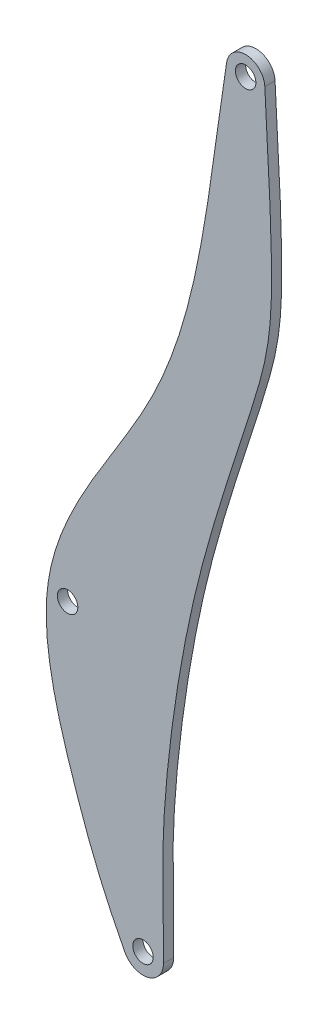
ISO-10303-21;
HEADER;
FILE_DESCRIPTION(('STEP AP214'),'2;1');
FILE_NAME('part.step','',(''),(''),'','','');
FILE_SCHEMA(('AUTOMOTIVE_DESIGN { 1 0 10303 214 1 1 1 1 }'));
ENDSEC;
DATA;
#1=APPLICATION_CONTEXT('core data for automotive mechanical design processes');
#2=APPLICATION_PROTOCOL_DEFINITION('international standard','automotive_design',2000,#1);
#3=PRODUCT_CONTEXT('',#1,'mechanical');
#4=PRODUCT('Part','Part','',(#3));
#5=PRODUCT_RELATED_PRODUCT_CATEGORY('part','',(#4));
#6=PRODUCT_DEFINITION_FORMATION('','',#4);
#7=PRODUCT_DEFINITION_CONTEXT('part definition',#1,'design');
#8=PRODUCT_DEFINITION('design','',#6,#7);
#9=PRODUCT_DEFINITION_SHAPE('','',#8);
#10=(LENGTH_UNIT() NAMED_UNIT(*) SI_UNIT(.MILLI.,.METRE.));
#11=(NAMED_UNIT(*) PLANE_ANGLE_UNIT() SI_UNIT($,.RADIAN.));
#12=(NAMED_UNIT(*) SI_UNIT($,.STERADIAN.) SOLID_ANGLE_UNIT());
#13=UNCERTAINTY_MEASURE_WITH_UNIT(LENGTH_MEASURE(1.E-05),#10,'distance_accuracy_value','');
#14=(GEOMETRIC_REPRESENTATION_CONTEXT(3) GLOBAL_UNCERTAINTY_ASSIGNED_CONTEXT((#13)) GLOBAL_UNIT_ASSIGNED_CONTEXT((#10,
#11,#12)) REPRESENTATION_CONTEXT('',''));
#15=CARTESIAN_POINT('',(0.,0.,0.));
#16=DIRECTION('',(0.,0.,1.));
#17=DIRECTION('',(1.,0.,0.));
#18=AXIS2_PLACEMENT_3D('',#15,#16,#17);
#19=CARTESIAN_POINT('',(83.5740256800296,374.071633918416,10.));
#20=DIRECTION('',(0.,0.,-1.));
#21=DIRECTION('',(-1.,0.,0.));
#22=AXIS2_PLACEMENT_3D('',#19,#20,#21);
#23=CYLINDRICAL_SURFACE('',#22,18.766036201656);
#24=CARTESIAN_POINT('',(83.5740256800296,374.071633918416,0.));
#25=DIRECTION('',(0.,0.,1.));
#26=DIRECTION('',(1.,0.,0.));
#27=AXIS2_PLACEMENT_3D('',#24,#25,#26);
#28=CIRCLE('',#27,18.766036201656);
#29=CARTESIAN_POINT('',(102.311199764937,375.112029051879,0.));
#30=VERTEX_POINT('',#29);
#31=CARTESIAN_POINT('',(65.0364619426126,376.991025191107,0.));
#32=VERTEX_POINT('',#31);
#33=EDGE_CURVE('E144',#30,#32,#28,.T.);
#34=ORIENTED_EDGE('',*,*,#33,.T.);
#35=DIRECTION('',(0.,0.,-1.));
#36=VECTOR('',#35,1.);
#37=CARTESIAN_POINT('',(65.0364619426126,376.991025191107,10.));
#38=LINE('',#37,#36);
#39=CARTESIAN_POINT('',(65.0364619426126,376.991025191107,10.));
#40=VERTEX_POINT('',#39);
#41=EDGE_CURVE('E11',#40,#32,#38,.T.);
#42=ORIENTED_EDGE('',*,*,#41,.F.);
#43=CARTESIAN_POINT('',(83.5740256800296,374.071633918416,10.));
#44=DIRECTION('',(0.,0.,1.));
#45=DIRECTION('',(1.,0.,0.));
#46=AXIS2_PLACEMENT_3D('',#43,#44,#45);
#47=CIRCLE('',#46,18.766036201656);
#48=CARTESIAN_POINT('',(102.311199764937,375.112029051879,10.));
#49=VERTEX_POINT('',#48);
#50=EDGE_CURVE('E86',#49,#40,#47,.T.);
#51=ORIENTED_EDGE('',*,*,#50,.F.);
#52=DIRECTION('',(0.,0.,-1.));
#53=VECTOR('',#52,1.);
#54=CARTESIAN_POINT('',(102.311199764937,375.112029051879,10.));
#55=LINE('',#54,#53);
#56=EDGE_CURVE('E53',#49,#30,#55,.T.);
#57=ORIENTED_EDGE('',*,*,#56,.T.);
#58=EDGE_LOOP('',(#34,#42,#51,#57));
#59=FACE_BOUND('',#58,.T.);
#60=ADVANCED_FACE('F36',(#59),#23,.T.);
#61=CARTESIAN_POINT('',(65.0364619426127,376.991025191107,10.));
#62=CARTESIAN_POINT('',(45.8891142145235,252.942246970304,10.));
#63=CARTESIAN_POINT('',(35.5238069950135,78.6944400884925,10.));
#64=CARTESIAN_POINT('',(-140.807905588771,-126.022717355583,10.));
#65=CARTESIAN_POINT('',(-84.8262219497264,-308.616556426577,10.));
#66=CARTESIAN_POINT('',(-57.33119301241,-381.180627859688,10.));
#67=CARTESIAN_POINT('',(-34.1365743105431,-425.390150910679,10.));
#68=B_SPLINE_CURVE_WITH_KNOTS('',3,(#61,#62,#63,#64,#65,#66,#67),.UNSPECIFIED.,.F.,.F.,(4,1,1,1,
4),(0.,0.394447099617431,0.667710934704423,0.855398118927933,1.),.UNSPECIFIED.);
#69=DIRECTION('',(0.,0.,-1.));
#70=VECTOR('',#69,1.);
#71=SURFACE_OF_LINEAR_EXTRUSION('',#68,#70);
#72=CARTESIAN_POINT('',(65.0364619426127,376.991025191107,0.));
#73=CARTESIAN_POINT('',(45.8891142145235,252.942246970304,0.));
#74=CARTESIAN_POINT('',(35.5238069950135,78.6944400884925,0.));
#75=CARTESIAN_POINT('',(-140.807905588771,-126.022717355583,0.));
#76=CARTESIAN_POINT('',(-84.8262219497264,-308.616556426577,0.));
#77=CARTESIAN_POINT('',(-57.33119301241,-381.180627859688,0.));
#78=CARTESIAN_POINT('',(-34.1365743105431,-425.390150910679,0.));
#79=B_SPLINE_CURVE_WITH_KNOTS('',3,(#72,#73,#74,#75,#76,#77,#78),.UNSPECIFIED.,.F.,.F.,(4,1,1,1,
4),(0.,0.394447099617431,0.667710934704423,0.855398118927933,1.),.UNSPECIFIED.);
#80=CARTESIAN_POINT('',(-34.1365743105431,-425.390150910679,0.));
#81=VERTEX_POINT('',#80);
#82=EDGE_CURVE('E91',#32,#81,#79,.T.);
#83=ORIENTED_EDGE('',*,*,#82,.T.);
#84=DIRECTION('',(0.,0.,-1.));
#85=VECTOR('',#84,1.);
#86=CARTESIAN_POINT('',(-34.1365743105431,-425.390150910679,10.));
#87=LINE('',#86,#85);
#88=CARTESIAN_POINT('',(-34.1365743105431,-425.390150910679,10.));
#89=VERTEX_POINT('',#88);
#90=EDGE_CURVE('E45',#89,#81,#87,.T.);
#91=ORIENTED_EDGE('',*,*,#90,.F.);
#92=EDGE_CURVE('E79',#40,#89,#68,.T.);
#93=ORIENTED_EDGE('',*,*,#92,.F.);
#94=ORIENTED_EDGE('',*,*,#41,.T.);
#95=EDGE_LOOP('',(#83,#91,#93,#94));
#96=FACE_BOUND('',#95,.T.);
#97=ADVANCED_FACE('F90',(#96),#71,.F.);
#98=CARTESIAN_POINT('',(-16.6280988510506,-415.723026876906,10.));
#99=DIRECTION('',(0.,0.,-1.));
#100=DIRECTION('',(-1.,0.,0.));
#101=AXIS2_PLACEMENT_3D('',#98,#99,#100);
#102=CYLINDRICAL_SURFACE('',#101,20.);
#103=CARTESIAN_POINT('',(-16.6280988510506,-415.723026876906,0.));
#104=DIRECTION('',(0.,0.,1.));
#105=DIRECTION('',(1.,0.,0.));
#106=AXIS2_PLACEMENT_3D('',#103,#104,#105);
#107=CIRCLE('',#106,20.);
#108=CARTESIAN_POINT('',(3.3718966503124,-415.709612501793,0.));
#109=VERTEX_POINT('',#108);
#110=EDGE_CURVE('E152',#81,#109,#107,.T.);
#111=ORIENTED_EDGE('',*,*,#110,.T.);
#112=DIRECTION('',(0.,0.,-1.));
#113=VECTOR('',#112,1.);
#114=CARTESIAN_POINT('',(3.3718966503124,-415.709612501793,10.));
#115=LINE('',#114,#113);
#116=CARTESIAN_POINT('',(3.3718966503124,-415.709612501793,10.));
#117=VERTEX_POINT('',#116);
#118=EDGE_CURVE('E68',#117,#109,#115,.T.);
#119=ORIENTED_EDGE('',*,*,#118,.F.);
#120=CARTESIAN_POINT('',(-16.6280988510506,-415.723026876906,10.));
#121=DIRECTION('',(0.,0.,1.));
#122=DIRECTION('',(1.,0.,0.));
#123=AXIS2_PLACEMENT_3D('',#120,#121,#122);
#124=CIRCLE('',#123,20.);
#125=EDGE_CURVE('E85',#89,#117,#124,.T.);
#126=ORIENTED_EDGE('',*,*,#125,.F.);
#127=ORIENTED_EDGE('',*,*,#90,.T.);
#128=EDGE_LOOP('',(#111,#119,#126,#127));
#129=FACE_BOUND('',#128,.T.);
#130=ADVANCED_FACE('F94',(#129),#102,.T.);
#131=CARTESIAN_POINT('',(-16.6280988510506,-415.723026876906,10.));
#132=DIRECTION('',(0.,0.,-1.));
#133=DIRECTION('',(-1.,0.,0.));
#134=AXIS2_PLACEMENT_3D('',#131,#132,#133);
#135=CYLINDRICAL_SURFACE('',#134,10.);
#136=CARTESIAN_POINT('',(-16.6280988510506,-415.723026876906,10.));
#137=DIRECTION('',(0.,0.,1.));
#138=DIRECTION('',(1.,0.,0.));
#139=AXIS2_PLACEMENT_3D('',#136,#137,#138);
#140=CIRCLE('',#139,10.);
#141=CARTESIAN_POINT('',(-6.62809885105059,-415.723026876906,10.));
#142=VERTEX_POINT('',#141);
#143=EDGE_CURVE('E171',#142,#142,#140,.T.);
#144=ORIENTED_EDGE('',*,*,#143,.T.);
#145=EDGE_LOOP('',(#144));
#146=FACE_BOUND('',#145,.T.);
#147=CARTESIAN_POINT('',(-16.6280988510506,-415.723026876906,0.));
#148=DIRECTION('',(0.,0.,1.));
#149=DIRECTION('',(1.,0.,0.));
#150=AXIS2_PLACEMENT_3D('',#147,#148,#149);
#151=CIRCLE('',#150,10.);
#152=CARTESIAN_POINT('',(-6.62809885105059,-415.723026876906,0.));
#153=VERTEX_POINT('',#152);
#154=EDGE_CURVE('E142',#153,#153,#151,.T.);
#155=ORIENTED_EDGE('',*,*,#154,.F.);
#156=EDGE_LOOP('',(#155));
#157=FACE_BOUND('',#156,.T.);
#158=ADVANCED_FACE('F120',(#146,#157),#135,.F.);
#159=CARTESIAN_POINT('',(-90.2604699523245,-156.580915428372,10.));
#160=DIRECTION('',(0.,0.,-1.));
#161=DIRECTION('',(-1.,0.,0.));
#162=AXIS2_PLACEMENT_3D('',#159,#160,#161);
#163=CYLINDRICAL_SURFACE('',#162,10.);
#164=CARTESIAN_POINT('',(-90.2604699523245,-156.580915428372,10.));
#165=DIRECTION('',(0.,0.,1.));
#166=DIRECTION('',(1.,0.,0.));
#167=AXIS2_PLACEMENT_3D('',#164,#165,#166);
#168=CIRCLE('',#167,10.);
#169=CARTESIAN_POINT('',(-80.2604699523245,-156.580915428372,10.));
#170=VERTEX_POINT('',#169);
#171=EDGE_CURVE('E137',#170,#170,#168,.T.);
#172=ORIENTED_EDGE('',*,*,#171,.T.);
#173=EDGE_LOOP('',(#172));
#174=FACE_BOUND('',#173,.T.);
#175=CARTESIAN_POINT('',(-90.2604699523245,-156.580915428372,0.));
#176=DIRECTION('',(0.,0.,1.));
#177=DIRECTION('',(1.,0.,0.));
#178=AXIS2_PLACEMENT_3D('',#175,#176,#177);
#179=CIRCLE('',#178,10.);
#180=CARTESIAN_POINT('',(-80.2604699523245,-156.580915428372,0.));
#181=VERTEX_POINT('',#180);
#182=EDGE_CURVE('E140',#181,#181,#179,.T.);
#183=ORIENTED_EDGE('',*,*,#182,.F.);
#184=EDGE_LOOP('',(#183));
#185=FACE_BOUND('',#184,.T.);
#186=ADVANCED_FACE('F126',(#174,#185),#163,.F.);
#187=CARTESIAN_POINT('',(83.5740256800296,374.071633918416,10.));
#188=DIRECTION('',(0.,0.,-1.));
#189=DIRECTION('',(-1.,0.,0.));
#190=AXIS2_PLACEMENT_3D('',#187,#188,#189);
#191=CYLINDRICAL_SURFACE('',#190,9.99999999999998);
#192=CARTESIAN_POINT('',(83.5740256800296,374.071633918416,10.));
#193=DIRECTION('',(0.,0.,1.));
#194=DIRECTION('',(1.,0.,0.));
#195=AXIS2_PLACEMENT_3D('',#192,#193,#194);
#196=CIRCLE('',#195,9.99999999999998);
#197=CARTESIAN_POINT('',(93.5740256800296,374.071633918416,10.));
#198=VERTEX_POINT('',#197);
#199=EDGE_CURVE('E162',#198,#198,#196,.T.);
#200=ORIENTED_EDGE('',*,*,#199,.T.);
#201=EDGE_LOOP('',(#200));
#202=FACE_BOUND('',#201,.T.);
#203=CARTESIAN_POINT('',(83.5740256800296,374.071633918416,0.));
#204=DIRECTION('',(0.,0.,1.));
#205=DIRECTION('',(1.,0.,0.));
#206=AXIS2_PLACEMENT_3D('',#203,#204,#205);
#207=CIRCLE('',#206,9.99999999999998);
#208=CARTESIAN_POINT('',(93.5740256800296,374.071633918416,0.));
#209=VERTEX_POINT('',#208);
#210=EDGE_CURVE('E106',#209,#209,#207,.T.);
#211=ORIENTED_EDGE('',*,*,#210,.F.);
#212=EDGE_LOOP('',(#211));
#213=FACE_BOUND('',#212,.T.);
#214=ADVANCED_FACE('F38',(#202,#213),#191,.F.);
#215=CARTESIAN_POINT('',(102.311199764937,375.112029051879,10.));
#216=CARTESIAN_POINT('',(112.225704632122,196.55505806368,10.));
#217=CARTESIAN_POINT('',(112.566880399332,154.384362348897,10.));
#218=CARTESIAN_POINT('',(23.6862339858154,-90.7930914675676,10.));
#219=CARTESIAN_POINT('',(0.0347509275312966,-297.285781179755,10.));
#220=CARTESIAN_POINT('',(3.3310678761864,-354.836460231055,10.));
#221=CARTESIAN_POINT('',(3.37189665031239,-415.709612501793,10.));
#222=B_SPLINE_CURVE_WITH_KNOTS('',3,(#215,#216,#217,#218,#219,#220,#221),.UNSPECIFIED.,.F.,.F.,
(4,1,1,1,4),(0.,0.332735051809532,0.581141853524748,0.871633558135059,1.),.UNSPECIFIED.);
#223=DIRECTION('',(0.,0.,-1.));
#224=VECTOR('',#223,1.);
#225=SURFACE_OF_LINEAR_EXTRUSION('',#222,#224);
#226=CARTESIAN_POINT('',(102.311199764937,375.112029051879,0.));
#227=CARTESIAN_POINT('',(112.225704632122,196.55505806368,0.));
#228=CARTESIAN_POINT('',(112.566880399332,154.384362348897,0.));
#229=CARTESIAN_POINT('',(23.6862339858154,-90.7930914675676,0.));
#230=CARTESIAN_POINT('',(0.0347509275312966,-297.285781179755,0.));
#231=CARTESIAN_POINT('',(3.3310678761864,-354.836460231055,0.));
#232=CARTESIAN_POINT('',(3.37189665031239,-415.709612501793,0.));
#233=B_SPLINE_CURVE_WITH_KNOTS('',3,(#226,#227,#228,#229,#230,#231,#232),.UNSPECIFIED.,.F.,.F.,
(4,1,1,1,4),(0.,0.332735051809532,0.581141853524748,0.871633558135059,1.),.UNSPECIFIED.);
#234=EDGE_CURVE('E157',#30,#109,#233,.T.);
#235=ORIENTED_EDGE('',*,*,#234,.F.);
#236=ORIENTED_EDGE('',*,*,#56,.F.);
#237=EDGE_CURVE('E95',#49,#117,#222,.T.);
#238=ORIENTED_EDGE('',*,*,#237,.T.);
#239=ORIENTED_EDGE('',*,*,#118,.T.);
#240=EDGE_LOOP('',(#235,#236,#238,#239));
#241=FACE_BOUND('',#240,.T.);
#242=ADVANCED_FACE('F112',(#241),#225,.T.);
#243=CARTESIAN_POINT('',(0.,0.,10.));
#244=DIRECTION('',(0.,0.,1.));
#245=DIRECTION('',(1.,0.,0.));
#246=AXIS2_PLACEMENT_3D('',#243,#244,#245);
#247=PLANE('',#246);
#248=ORIENTED_EDGE('',*,*,#199,.F.);
#249=EDGE_LOOP('',(#248));
#250=FACE_BOUND('',#249,.T.);
#251=ORIENTED_EDGE('',*,*,#171,.F.);
#252=EDGE_LOOP('',(#251));
#253=FACE_BOUND('',#252,.T.);
#254=ORIENTED_EDGE('',*,*,#143,.F.);
#255=EDGE_LOOP('',(#254));
#256=FACE_BOUND('',#255,.T.);
#257=ORIENTED_EDGE('',*,*,#50,.T.);
#258=ORIENTED_EDGE('',*,*,#92,.T.);
#259=ORIENTED_EDGE('',*,*,#125,.T.);
#260=ORIENTED_EDGE('',*,*,#237,.F.);
#261=EDGE_LOOP('',(#257,#258,#259,#260));
#262=FACE_BOUND('',#261,.T.);
#263=ADVANCED_FACE('F82',(#250,#253,#256,#262),#247,.T.);
#264=CARTESIAN_POINT('',(0.,0.,0.));
#265=DIRECTION('',(0.,0.,1.));
#266=DIRECTION('',(1.,0.,0.));
#267=AXIS2_PLACEMENT_3D('',#264,#265,#266);
#268=PLANE('',#267);
#269=ORIENTED_EDGE('',*,*,#210,.T.);
#270=EDGE_LOOP('',(#269));
#271=FACE_BOUND('',#270,.T.);
#272=ORIENTED_EDGE('',*,*,#182,.T.);
#273=EDGE_LOOP('',(#272));
#274=FACE_BOUND('',#273,.T.);
#275=ORIENTED_EDGE('',*,*,#154,.T.);
#276=EDGE_LOOP('',(#275));
#277=FACE_BOUND('',#276,.T.);
#278=ORIENTED_EDGE('',*,*,#33,.F.);
#279=ORIENTED_EDGE('',*,*,#234,.T.);
#280=ORIENTED_EDGE('',*,*,#110,.F.);
#281=ORIENTED_EDGE('',*,*,#82,.F.);
#282=EDGE_LOOP('',(#278,#279,#280,#281));
#283=FACE_BOUND('',#282,.T.);
#284=ADVANCED_FACE('F116',(#271,#274,#277,#283),#268,.F.);
#285=CLOSED_SHELL('',(#60,#97,#130,#158,#186,#214,#242,#263,#284));
#286=MANIFOLD_SOLID_BREP('B2',#285);
#287=ADVANCED_BREP_SHAPE_REPRESENTATION('',(#18,#286),#14);
#288=SHAPE_DEFINITION_REPRESENTATION(#9,#287);
ENDSEC;
END-ISO-10303-21;
